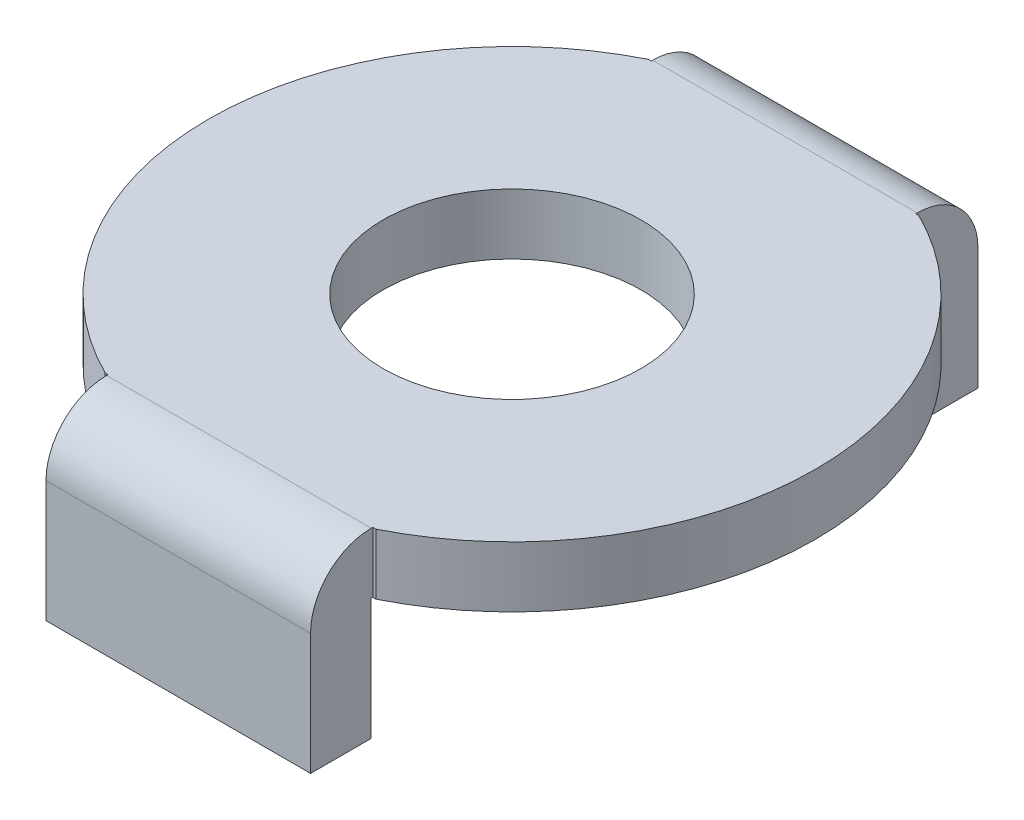
ISO-10303-21;
HEADER;
FILE_DESCRIPTION(('STEP AP214'),'2;1');
FILE_NAME('part.step','',(''),(''),'','','');
FILE_SCHEMA(('AUTOMOTIVE_DESIGN { 1 0 10303 214 1 1 1 1 }'));
ENDSEC;
DATA;
#1=APPLICATION_CONTEXT('core data for automotive mechanical design processes');
#2=APPLICATION_PROTOCOL_DEFINITION('international standard','automotive_design',2000,#1);
#3=PRODUCT_CONTEXT('',#1,'mechanical');
#4=PRODUCT('Part','Part','',(#3));
#5=PRODUCT_RELATED_PRODUCT_CATEGORY('part','',(#4));
#6=PRODUCT_DEFINITION_FORMATION('','',#4);
#7=PRODUCT_DEFINITION_CONTEXT('part definition',#1,'design');
#8=PRODUCT_DEFINITION('design','',#6,#7);
#9=PRODUCT_DEFINITION_SHAPE('','',#8);
#10=(LENGTH_UNIT() NAMED_UNIT(*) SI_UNIT(.MILLI.,.METRE.));
#11=(NAMED_UNIT(*) PLANE_ANGLE_UNIT() SI_UNIT($,.RADIAN.));
#12=(NAMED_UNIT(*) SI_UNIT($,.STERADIAN.) SOLID_ANGLE_UNIT());
#13=UNCERTAINTY_MEASURE_WITH_UNIT(LENGTH_MEASURE(1.E-05),#10,'distance_accuracy_value','');
#14=(GEOMETRIC_REPRESENTATION_CONTEXT(3) GLOBAL_UNCERTAINTY_ASSIGNED_CONTEXT((#13)) GLOBAL_UNIT_ASSIGNED_CONTEXT((#10,
#11,#12)) REPRESENTATION_CONTEXT('',''));
#15=CARTESIAN_POINT('',(0.,0.,0.));
#16=DIRECTION('',(0.,0.,1.));
#17=DIRECTION('',(1.,0.,0.));
#18=AXIS2_PLACEMENT_3D('',#15,#16,#17);
#19=CARTESIAN_POINT('',(4.360333,0.,9.));
#20=DIRECTION('',(1.,0.,0.));
#21=DIRECTION('',(0.,0.,-1.));
#22=AXIS2_PLACEMENT_3D('',#19,#20,#21);
#23=PLANE('',#22);
#24=DIRECTION('',(0.,0.,-1.));
#25=VECTOR('',#24,1.);
#26=CARTESIAN_POINT('',(4.360333,0.,9.));
#27=LINE('',#26,#25);
#28=CARTESIAN_POINT('',(4.360333,0.,9.));
#29=VERTEX_POINT('',#28);
#30=CARTESIAN_POINT('',(4.360333,0.,8.95));
#31=VERTEX_POINT('',#30);
#32=EDGE_CURVE('E237',#29,#31,#27,.T.);
#33=ORIENTED_EDGE('',*,*,#32,.T.);
#34=DIRECTION('',(0.,1.,0.));
#35=VECTOR('',#34,1.);
#36=CARTESIAN_POINT('',(4.360333,0.,8.95));
#37=LINE('',#36,#35);
#38=CARTESIAN_POINT('',(4.360333,2.,8.95));
#39=VERTEX_POINT('',#38);
#40=EDGE_CURVE('E50',#31,#39,#37,.T.);
#41=ORIENTED_EDGE('',*,*,#40,.T.);
#42=DIRECTION('',(0.,0.,1.));
#43=VECTOR('',#42,1.);
#44=CARTESIAN_POINT('',(4.360333,2.,-9.));
#45=LINE('',#44,#43);
#46=CARTESIAN_POINT('',(4.360333,2.,9.));
#47=VERTEX_POINT('',#46);
#48=EDGE_CURVE('E247',#39,#47,#45,.T.);
#49=ORIENTED_EDGE('',*,*,#48,.T.);
#50=CARTESIAN_POINT('',(4.360333,0.,9.));
#51=DIRECTION('',(1.,0.,0.));
#52=DIRECTION('',(0.,0.,-1.));
#53=AXIS2_PLACEMENT_3D('',#50,#51,#52);
#54=CIRCLE('',#53,2.);
#55=CARTESIAN_POINT('',(4.360333,0.,11.));
#56=VERTEX_POINT('',#55);
#57=EDGE_CURVE('E227',#47,#56,#54,.T.);
#58=ORIENTED_EDGE('',*,*,#57,.T.);
#59=DIRECTION('',(0.,-1.,0.));
#60=VECTOR('',#59,1.);
#61=CARTESIAN_POINT('',(4.360333,0.,11.));
#62=LINE('',#61,#60);
#63=CARTESIAN_POINT('',(4.360333,-4.,11.));
#64=VERTEX_POINT('',#63);
#65=EDGE_CURVE('E230',#56,#64,#62,.T.);
#66=ORIENTED_EDGE('',*,*,#65,.T.);
#67=DIRECTION('',(0.,0.,-1.));
#68=VECTOR('',#67,1.);
#69=CARTESIAN_POINT('',(4.360333,-4.,11.));
#70=LINE('',#69,#68);
#71=CARTESIAN_POINT('',(4.360333,-4.,9.));
#72=VERTEX_POINT('',#71);
#73=EDGE_CURVE('E232',#64,#72,#70,.T.);
#74=ORIENTED_EDGE('',*,*,#73,.T.);
#75=DIRECTION('',(0.,1.,0.));
#76=VECTOR('',#75,1.);
#77=CARTESIAN_POINT('',(4.360333,-4.,9.));
#78=LINE('',#77,#76);
#79=EDGE_CURVE('E234',#72,#29,#78,.T.);
#80=ORIENTED_EDGE('',*,*,#79,.T.);
#81=EDGE_LOOP('',(#33,#41,#49,#58,#66,#74,#80));
#82=FACE_BOUND('',#81,.T.);
#83=ADVANCED_FACE('F35',(#82),#23,.T.);
#84=CARTESIAN_POINT('',(4.360333,2.,-9.));
#85=VERTEX_POINT('',#84);
#86=CARTESIAN_POINT('',(4.360333,2.,-8.95));
#87=VERTEX_POINT('',#86);
#88=EDGE_CURVE('E58',#85,#87,#45,.T.);
#89=ORIENTED_EDGE('',*,*,#88,.T.);
#90=DIRECTION('',(0.,-1.,0.));
#91=VECTOR('',#90,1.);
#92=CARTESIAN_POINT('',(4.360333,0.,-8.95));
#93=LINE('',#92,#91);
#94=CARTESIAN_POINT('',(4.360333,0.,-8.95));
#95=VERTEX_POINT('',#94);
#96=EDGE_CURVE('E186',#87,#95,#93,.T.);
#97=ORIENTED_EDGE('',*,*,#96,.T.);
#98=CARTESIAN_POINT('',(4.360333,0.,-9.));
#99=VERTEX_POINT('',#98);
#100=EDGE_CURVE('E236',#95,#99,#27,.T.);
#101=ORIENTED_EDGE('',*,*,#100,.T.);
#102=DIRECTION('',(0.,-1.,0.));
#103=VECTOR('',#102,1.);
#104=CARTESIAN_POINT('',(4.360333,0.,-9.));
#105=LINE('',#104,#103);
#106=CARTESIAN_POINT('',(4.360333,-4.,-9.));
#107=VERTEX_POINT('',#106);
#108=EDGE_CURVE('E239',#99,#107,#105,.T.);
#109=ORIENTED_EDGE('',*,*,#108,.T.);
#110=DIRECTION('',(0.,0.,-1.));
#111=VECTOR('',#110,1.);
#112=CARTESIAN_POINT('',(4.360333,-4.,-9.));
#113=LINE('',#112,#111);
#114=CARTESIAN_POINT('',(4.360333,-4.,-11.));
#115=VERTEX_POINT('',#114);
#116=EDGE_CURVE('E241',#107,#115,#113,.T.);
#117=ORIENTED_EDGE('',*,*,#116,.T.);
#118=DIRECTION('',(0.,1.,0.));
#119=VECTOR('',#118,1.);
#120=CARTESIAN_POINT('',(4.360333,-4.,-11.));
#121=LINE('',#120,#119);
#122=CARTESIAN_POINT('',(4.360333,0.,-11.));
#123=VERTEX_POINT('',#122);
#124=EDGE_CURVE('E243',#115,#123,#121,.T.);
#125=ORIENTED_EDGE('',*,*,#124,.T.);
#126=CARTESIAN_POINT('',(4.360333,0.,-9.));
#127=DIRECTION('',(1.,0.,0.));
#128=DIRECTION('',(0.,0.,-1.));
#129=AXIS2_PLACEMENT_3D('',#126,#127,#128);
#130=CIRCLE('',#129,2.);
#131=EDGE_CURVE('E245',#123,#85,#130,.T.);
#132=ORIENTED_EDGE('',*,*,#131,.T.);
#133=EDGE_LOOP('',(#89,#97,#101,#109,#117,#125,#132));
#134=FACE_BOUND('',#133,.T.);
#135=ADVANCED_FACE('F289',(#134),#23,.T.);
#136=CARTESIAN_POINT('',(-4.360333,0.,9.));
#137=DIRECTION('',(1.,0.,0.));
#138=DIRECTION('',(0.,0.,-1.));
#139=AXIS2_PLACEMENT_3D('',#136,#137,#138);
#140=PLANE('',#139);
#141=DIRECTION('',(0.,1.,0.));
#142=VECTOR('',#141,1.);
#143=CARTESIAN_POINT('',(-4.360333,0.,8.95));
#144=LINE('',#143,#142);
#145=CARTESIAN_POINT('',(-4.360333,0.,8.95));
#146=VERTEX_POINT('',#145);
#147=CARTESIAN_POINT('',(-4.360333,2.,8.95));
#148=VERTEX_POINT('',#147);
#149=EDGE_CURVE('E11',#146,#148,#144,.T.);
#150=ORIENTED_EDGE('',*,*,#149,.F.);
#151=DIRECTION('',(0.,0.,-1.));
#152=VECTOR('',#151,1.);
#153=CARTESIAN_POINT('',(-4.360333,0.,9.));
#154=LINE('',#153,#152);
#155=CARTESIAN_POINT('',(-4.360333,0.,9.));
#156=VERTEX_POINT('',#155);
#157=EDGE_CURVE('E209',#156,#146,#154,.T.);
#158=ORIENTED_EDGE('',*,*,#157,.F.);
#159=DIRECTION('',(0.,1.,0.));
#160=VECTOR('',#159,1.);
#161=CARTESIAN_POINT('',(-4.360333,-4.,9.));
#162=LINE('',#161,#160);
#163=CARTESIAN_POINT('',(-4.360333,-4.,9.));
#164=VERTEX_POINT('',#163);
#165=EDGE_CURVE('E205',#164,#156,#162,.T.);
#166=ORIENTED_EDGE('',*,*,#165,.F.);
#167=DIRECTION('',(0.,0.,-1.));
#168=VECTOR('',#167,1.);
#169=CARTESIAN_POINT('',(-4.360333,-4.,11.));
#170=LINE('',#169,#168);
#171=CARTESIAN_POINT('',(-4.360333,-4.,11.));
#172=VERTEX_POINT('',#171);
#173=EDGE_CURVE('E202',#172,#164,#170,.T.);
#174=ORIENTED_EDGE('',*,*,#173,.F.);
#175=DIRECTION('',(0.,-1.,0.));
#176=VECTOR('',#175,1.);
#177=CARTESIAN_POINT('',(-4.360333,0.,11.));
#178=LINE('',#177,#176);
#179=CARTESIAN_POINT('',(-4.360333,0.,11.));
#180=VERTEX_POINT('',#179);
#181=EDGE_CURVE('E199',#180,#172,#178,.T.);
#182=ORIENTED_EDGE('',*,*,#181,.F.);
#183=CARTESIAN_POINT('',(-4.360333,0.,9.));
#184=DIRECTION('',(1.,0.,0.));
#185=DIRECTION('',(0.,0.,-1.));
#186=AXIS2_PLACEMENT_3D('',#183,#184,#185);
#187=CIRCLE('',#186,2.);
#188=CARTESIAN_POINT('',(-4.360333,2.,9.));
#189=VERTEX_POINT('',#188);
#190=EDGE_CURVE('E196',#189,#180,#187,.T.);
#191=ORIENTED_EDGE('',*,*,#190,.F.);
#192=DIRECTION('',(0.,0.,1.));
#193=VECTOR('',#192,1.);
#194=CARTESIAN_POINT('',(-4.360333,2.,-9.));
#195=LINE('',#194,#193);
#196=EDGE_CURVE('E224',#148,#189,#195,.T.);
#197=ORIENTED_EDGE('',*,*,#196,.F.);
#198=EDGE_LOOP('',(#150,#158,#166,#174,#182,#191,#197));
#199=FACE_BOUND('',#198,.T.);
#200=ADVANCED_FACE('F343',(#199),#140,.F.);
#201=DIRECTION('',(0.,-1.,0.));
#202=VECTOR('',#201,1.);
#203=CARTESIAN_POINT('',(-4.360333,0.,-8.95));
#204=LINE('',#203,#202);
#205=CARTESIAN_POINT('',(-4.360333,2.,-8.95));
#206=VERTEX_POINT('',#205);
#207=CARTESIAN_POINT('',(-4.360333,0.,-8.95));
#208=VERTEX_POINT('',#207);
#209=EDGE_CURVE('E43',#206,#208,#204,.T.);
#210=ORIENTED_EDGE('',*,*,#209,.F.);
#211=CARTESIAN_POINT('',(-4.360333,2.,-9.));
#212=VERTEX_POINT('',#211);
#213=EDGE_CURVE('E225',#212,#206,#195,.T.);
#214=ORIENTED_EDGE('',*,*,#213,.F.);
#215=CARTESIAN_POINT('',(-4.360333,0.,-9.));
#216=DIRECTION('',(1.,0.,0.));
#217=DIRECTION('',(0.,0.,-1.));
#218=AXIS2_PLACEMENT_3D('',#215,#216,#217);
#219=CIRCLE('',#218,2.);
#220=CARTESIAN_POINT('',(-4.360333,0.,-11.));
#221=VERTEX_POINT('',#220);
#222=EDGE_CURVE('E221',#221,#212,#219,.T.);
#223=ORIENTED_EDGE('',*,*,#222,.F.);
#224=DIRECTION('',(0.,1.,0.));
#225=VECTOR('',#224,1.);
#226=CARTESIAN_POINT('',(-4.360333,-4.,-11.));
#227=LINE('',#226,#225);
#228=CARTESIAN_POINT('',(-4.360333,-4.,-11.));
#229=VERTEX_POINT('',#228);
#230=EDGE_CURVE('E218',#229,#221,#227,.T.);
#231=ORIENTED_EDGE('',*,*,#230,.F.);
#232=DIRECTION('',(0.,0.,-1.));
#233=VECTOR('',#232,1.);
#234=CARTESIAN_POINT('',(-4.360333,-4.,-9.));
#235=LINE('',#234,#233);
#236=CARTESIAN_POINT('',(-4.360333,-4.,-9.));
#237=VERTEX_POINT('',#236);
#238=EDGE_CURVE('E215',#237,#229,#235,.T.);
#239=ORIENTED_EDGE('',*,*,#238,.F.);
#240=DIRECTION('',(0.,-1.,0.));
#241=VECTOR('',#240,1.);
#242=CARTESIAN_POINT('',(-4.360333,0.,-9.));
#243=LINE('',#242,#241);
#244=CARTESIAN_POINT('',(-4.360333,0.,-9.));
#245=VERTEX_POINT('',#244);
#246=EDGE_CURVE('E212',#245,#237,#243,.T.);
#247=ORIENTED_EDGE('',*,*,#246,.F.);
#248=EDGE_CURVE('E208',#208,#245,#154,.T.);
#249=ORIENTED_EDGE('',*,*,#248,.F.);
#250=EDGE_LOOP('',(#210,#214,#223,#231,#239,#247,#249));
#251=FACE_BOUND('',#250,.T.);
#252=ADVANCED_FACE('F279',(#251),#140,.F.);
#253=CARTESIAN_POINT('',(4.360333,0.,9.));
#254=DIRECTION('',(-1.,0.,0.));
#255=DIRECTION('',(0.,0.,1.));
#256=AXIS2_PLACEMENT_3D('',#253,#254,#255);
#257=CYLINDRICAL_SURFACE('',#256,2.);
#258=DIRECTION('',(-1.,0.,0.));
#259=VECTOR('',#258,1.);
#260=CARTESIAN_POINT('',(4.360333,2.,9.));
#261=LINE('',#260,#259);
#262=EDGE_CURVE('E249',#47,#189,#261,.T.);
#263=ORIENTED_EDGE('',*,*,#262,.T.);
#264=ORIENTED_EDGE('',*,*,#190,.T.);
#265=DIRECTION('',(-1.,0.,0.));
#266=VECTOR('',#265,1.);
#267=CARTESIAN_POINT('',(4.360333,0.,11.));
#268=LINE('',#267,#266);
#269=EDGE_CURVE('E269',#56,#180,#268,.T.);
#270=ORIENTED_EDGE('',*,*,#269,.F.);
#271=ORIENTED_EDGE('',*,*,#57,.F.);
#272=EDGE_LOOP('',(#263,#264,#270,#271));
#273=FACE_BOUND('',#272,.T.);
#274=ADVANCED_FACE('F37',(#273),#257,.T.);
#275=CARTESIAN_POINT('',(4.360333,0.,11.));
#276=DIRECTION('',(0.,0.,-1.));
#277=DIRECTION('',(-1.,0.,0.));
#278=AXIS2_PLACEMENT_3D('',#275,#276,#277);
#279=PLANE('',#278);
#280=ORIENTED_EDGE('',*,*,#269,.T.);
#281=ORIENTED_EDGE('',*,*,#181,.T.);
#282=DIRECTION('',(-1.,0.,0.));
#283=VECTOR('',#282,1.);
#284=CARTESIAN_POINT('',(4.360333,-4.,11.));
#285=LINE('',#284,#283);
#286=EDGE_CURVE('E267',#64,#172,#285,.T.);
#287=ORIENTED_EDGE('',*,*,#286,.F.);
#288=ORIENTED_EDGE('',*,*,#65,.F.);
#289=EDGE_LOOP('',(#280,#281,#287,#288));
#290=FACE_BOUND('',#289,.T.);
#291=ADVANCED_FACE('F440',(#290),#279,.F.);
#292=CARTESIAN_POINT('',(4.360333,-4.,11.));
#293=DIRECTION('',(0.,1.,0.));
#294=DIRECTION('',(0.,0.,1.));
#295=AXIS2_PLACEMENT_3D('',#292,#293,#294);
#296=PLANE('',#295);
#297=ORIENTED_EDGE('',*,*,#286,.T.);
#298=ORIENTED_EDGE('',*,*,#173,.T.);
#299=DIRECTION('',(-1.,0.,0.));
#300=VECTOR('',#299,1.);
#301=CARTESIAN_POINT('',(4.360333,-4.,9.));
#302=LINE('',#301,#300);
#303=EDGE_CURVE('E265',#72,#164,#302,.T.);
#304=ORIENTED_EDGE('',*,*,#303,.F.);
#305=ORIENTED_EDGE('',*,*,#73,.F.);
#306=EDGE_LOOP('',(#297,#298,#304,#305));
#307=FACE_BOUND('',#306,.T.);
#308=ADVANCED_FACE('F432',(#307),#296,.F.);
#309=CARTESIAN_POINT('',(4.360333,-4.,9.));
#310=DIRECTION('',(0.,0.,1.));
#311=DIRECTION('',(1.,0.,0.));
#312=AXIS2_PLACEMENT_3D('',#309,#310,#311);
#313=PLANE('',#312);
#314=ORIENTED_EDGE('',*,*,#303,.T.);
#315=ORIENTED_EDGE('',*,*,#165,.T.);
#316=DIRECTION('',(-1.,0.,0.));
#317=VECTOR('',#316,1.);
#318=CARTESIAN_POINT('',(4.360333,0.,9.));
#319=LINE('',#318,#317);
#320=EDGE_CURVE('E263',#29,#156,#319,.T.);
#321=ORIENTED_EDGE('',*,*,#320,.F.);
#322=ORIENTED_EDGE('',*,*,#79,.F.);
#323=EDGE_LOOP('',(#314,#315,#321,#322));
#324=FACE_BOUND('',#323,.T.);
#325=ADVANCED_FACE('F424',(#324),#313,.F.);
#326=CARTESIAN_POINT('',(4.360333,0.,9.));
#327=DIRECTION('',(0.,1.,0.));
#328=DIRECTION('',(0.,0.,1.));
#329=AXIS2_PLACEMENT_3D('',#326,#327,#328);
#330=PLANE('',#329);
#331=CARTESIAN_POINT('',(0.,0.,0.));
#332=DIRECTION('',(0.,1.,0.));
#333=DIRECTION('',(0.,0.,1.));
#334=AXIS2_PLACEMENT_3D('',#331,#332,#333);
#335=CIRCLE('',#334,4.25);
#336=CARTESIAN_POINT('',(0.,0.,4.25));
#337=VERTEX_POINT('',#336);
#338=EDGE_CURVE('E318',#337,#337,#335,.T.);
#339=ORIENTED_EDGE('',*,*,#338,.T.);
#340=EDGE_LOOP('',(#339));
#341=FACE_BOUND('',#340,.T.);
#342=DIRECTION('',(-1.,0.,0.));
#343=VECTOR('',#342,1.);
#344=CARTESIAN_POINT('',(4.46066138593819,0.,-8.95));
#345=LINE('',#344,#343);
#346=CARTESIAN_POINT('',(-4.46066138593819,0.,-8.95));
#347=VERTEX_POINT('',#346);
#348=EDGE_CURVE('E275',#208,#347,#345,.T.);
#349=ORIENTED_EDGE('',*,*,#348,.F.);
#350=ORIENTED_EDGE('',*,*,#248,.T.);
#351=DIRECTION('',(-1.,0.,0.));
#352=VECTOR('',#351,1.);
#353=CARTESIAN_POINT('',(4.360333,0.,-9.));
#354=LINE('',#353,#352);
#355=EDGE_CURVE('E260',#99,#245,#354,.T.);
#356=ORIENTED_EDGE('',*,*,#355,.F.);
#357=ORIENTED_EDGE('',*,*,#100,.F.);
#358=CARTESIAN_POINT('',(4.46066138593819,0.,-8.95));
#359=VERTEX_POINT('',#358);
#360=EDGE_CURVE('E181',#359,#95,#345,.T.);
#361=ORIENTED_EDGE('',*,*,#360,.F.);
#362=CARTESIAN_POINT('',(0.,0.,0.));
#363=DIRECTION('',(0.,1.,0.));
#364=DIRECTION('',(0.,0.,1.));
#365=AXIS2_PLACEMENT_3D('',#362,#363,#364);
#366=CIRCLE('',#365,10.);
#367=CARTESIAN_POINT('',(4.46066138593819,0.,8.95));
#368=VERTEX_POINT('',#367);
#369=EDGE_CURVE('E295',#368,#359,#366,.T.);
#370=ORIENTED_EDGE('',*,*,#369,.F.);
#371=DIRECTION('',(1.,0.,0.));
#372=VECTOR('',#371,1.);
#373=CARTESIAN_POINT('',(-4.46066138593819,0.,8.95));
#374=LINE('',#373,#372);
#375=EDGE_CURVE('E312',#31,#368,#374,.T.);
#376=ORIENTED_EDGE('',*,*,#375,.F.);
#377=ORIENTED_EDGE('',*,*,#32,.F.);
#378=ORIENTED_EDGE('',*,*,#320,.T.);
#379=ORIENTED_EDGE('',*,*,#157,.T.);
#380=CARTESIAN_POINT('',(-4.46066138593819,0.,8.95));
#381=VERTEX_POINT('',#380);
#382=EDGE_CURVE('E311',#381,#146,#374,.T.);
#383=ORIENTED_EDGE('',*,*,#382,.F.);
#384=CARTESIAN_POINT('',(0.,0.,0.));
#385=DIRECTION('',(0.,1.,0.));
#386=DIRECTION('',(0.,0.,1.));
#387=AXIS2_PLACEMENT_3D('',#384,#385,#386);
#388=CIRCLE('',#387,10.);
#389=EDGE_CURVE('E185',#347,#381,#388,.T.);
#390=ORIENTED_EDGE('',*,*,#389,.F.);
#391=EDGE_LOOP('',(#349,#350,#356,#357,#361,#370,#376,#377,#378,#379,#383,#390));
#392=FACE_BOUND('',#391,.T.);
#393=ADVANCED_FACE('F283',(#341,#392),#330,.F.);
#394=CARTESIAN_POINT('',(4.360333,0.,-9.));
#395=DIRECTION('',(0.,0.,-1.));
#396=DIRECTION('',(-1.,0.,0.));
#397=AXIS2_PLACEMENT_3D('',#394,#395,#396);
#398=PLANE('',#397);
#399=ORIENTED_EDGE('',*,*,#355,.T.);
#400=ORIENTED_EDGE('',*,*,#246,.T.);
#401=DIRECTION('',(-1.,0.,0.));
#402=VECTOR('',#401,1.);
#403=CARTESIAN_POINT('',(4.360333,-4.,-9.));
#404=LINE('',#403,#402);
#405=EDGE_CURVE('E258',#107,#237,#404,.T.);
#406=ORIENTED_EDGE('',*,*,#405,.F.);
#407=ORIENTED_EDGE('',*,*,#108,.F.);
#408=EDGE_LOOP('',(#399,#400,#406,#407));
#409=FACE_BOUND('',#408,.T.);
#410=ADVANCED_FACE('F286',(#409),#398,.F.);
#411=CARTESIAN_POINT('',(4.360333,-4.,-9.));
#412=DIRECTION('',(0.,1.,0.));
#413=DIRECTION('',(0.,0.,1.));
#414=AXIS2_PLACEMENT_3D('',#411,#412,#413);
#415=PLANE('',#414);
#416=ORIENTED_EDGE('',*,*,#405,.T.);
#417=ORIENTED_EDGE('',*,*,#238,.T.);
#418=DIRECTION('',(-1.,0.,0.));
#419=VECTOR('',#418,1.);
#420=CARTESIAN_POINT('',(4.360333,-4.,-11.));
#421=LINE('',#420,#419);
#422=EDGE_CURVE('E256',#115,#229,#421,.T.);
#423=ORIENTED_EDGE('',*,*,#422,.F.);
#424=ORIENTED_EDGE('',*,*,#116,.F.);
#425=EDGE_LOOP('',(#416,#417,#423,#424));
#426=FACE_BOUND('',#425,.T.);
#427=ADVANCED_FACE('F400',(#426),#415,.F.);
#428=CARTESIAN_POINT('',(4.360333,-4.,-11.));
#429=DIRECTION('',(0.,0.,1.));
#430=DIRECTION('',(1.,0.,0.));
#431=AXIS2_PLACEMENT_3D('',#428,#429,#430);
#432=PLANE('',#431);
#433=ORIENTED_EDGE('',*,*,#422,.T.);
#434=ORIENTED_EDGE('',*,*,#230,.T.);
#435=DIRECTION('',(-1.,0.,0.));
#436=VECTOR('',#435,1.);
#437=CARTESIAN_POINT('',(4.360333,0.,-11.));
#438=LINE('',#437,#436);
#439=EDGE_CURVE('E254',#123,#221,#438,.T.);
#440=ORIENTED_EDGE('',*,*,#439,.F.);
#441=ORIENTED_EDGE('',*,*,#124,.F.);
#442=EDGE_LOOP('',(#433,#434,#440,#441));
#443=FACE_BOUND('',#442,.T.);
#444=ADVANCED_FACE('F335',(#443),#432,.F.);
#445=CARTESIAN_POINT('',(4.360333,0.,-9.));
#446=DIRECTION('',(-1.,0.,0.));
#447=DIRECTION('',(0.,0.,1.));
#448=AXIS2_PLACEMENT_3D('',#445,#446,#447);
#449=CYLINDRICAL_SURFACE('',#448,2.);
#450=ORIENTED_EDGE('',*,*,#439,.T.);
#451=ORIENTED_EDGE('',*,*,#222,.T.);
#452=DIRECTION('',(-1.,0.,0.));
#453=VECTOR('',#452,1.);
#454=CARTESIAN_POINT('',(4.360333,2.,-9.));
#455=LINE('',#454,#453);
#456=EDGE_CURVE('E252',#85,#212,#455,.T.);
#457=ORIENTED_EDGE('',*,*,#456,.F.);
#458=ORIENTED_EDGE('',*,*,#131,.F.);
#459=EDGE_LOOP('',(#450,#451,#457,#458));
#460=FACE_BOUND('',#459,.T.);
#461=ADVANCED_FACE('F328',(#460),#449,.T.);
#462=CARTESIAN_POINT('',(4.360333,2.,-9.));
#463=DIRECTION('',(0.,-1.,0.));
#464=DIRECTION('',(0.,0.,-1.));
#465=AXIS2_PLACEMENT_3D('',#462,#463,#464);
#466=PLANE('',#465);
#467=CARTESIAN_POINT('',(0.,2.,0.));
#468=DIRECTION('',(0.,1.,0.));
#469=DIRECTION('',(0.,0.,1.));
#470=AXIS2_PLACEMENT_3D('',#467,#468,#469);
#471=CIRCLE('',#470,4.25);
#472=CARTESIAN_POINT('',(0.,2.,4.25));
#473=VERTEX_POINT('',#472);
#474=EDGE_CURVE('E315',#473,#473,#471,.T.);
#475=ORIENTED_EDGE('',*,*,#474,.F.);
#476=EDGE_LOOP('',(#475));
#477=FACE_BOUND('',#476,.T.);
#478=DIRECTION('',(-1.,0.,0.));
#479=VECTOR('',#478,1.);
#480=CARTESIAN_POINT('',(4.46066138593819,2.,-8.95));
#481=LINE('',#480,#479);
#482=CARTESIAN_POINT('',(4.46066138593819,2.,-8.95));
#483=VERTEX_POINT('',#482);
#484=EDGE_CURVE('E303',#483,#87,#481,.T.);
#485=ORIENTED_EDGE('',*,*,#484,.T.);
#486=ORIENTED_EDGE('',*,*,#88,.F.);
#487=ORIENTED_EDGE('',*,*,#456,.T.);
#488=ORIENTED_EDGE('',*,*,#213,.T.);
#489=CARTESIAN_POINT('',(-4.46066138593819,2.,-8.95));
#490=VERTEX_POINT('',#489);
#491=EDGE_CURVE('E177',#206,#490,#481,.T.);
#492=ORIENTED_EDGE('',*,*,#491,.T.);
#493=CARTESIAN_POINT('',(0.,2.,0.));
#494=DIRECTION('',(0.,1.,0.));
#495=DIRECTION('',(0.,0.,1.));
#496=AXIS2_PLACEMENT_3D('',#493,#494,#495);
#497=CIRCLE('',#496,10.);
#498=CARTESIAN_POINT('',(-4.46066138593819,2.,8.95));
#499=VERTEX_POINT('',#498);
#500=EDGE_CURVE('E173',#490,#499,#497,.T.);
#501=ORIENTED_EDGE('',*,*,#500,.T.);
#502=DIRECTION('',(1.,0.,0.));
#503=VECTOR('',#502,1.);
#504=CARTESIAN_POINT('',(-4.46066138593819,2.,8.95));
#505=LINE('',#504,#503);
#506=EDGE_CURVE('E160',#499,#148,#505,.T.);
#507=ORIENTED_EDGE('',*,*,#506,.T.);
#508=ORIENTED_EDGE('',*,*,#196,.T.);
#509=ORIENTED_EDGE('',*,*,#262,.F.);
#510=ORIENTED_EDGE('',*,*,#48,.F.);
#511=CARTESIAN_POINT('',(4.46066138593819,2.,8.95));
#512=VERTEX_POINT('',#511);
#513=EDGE_CURVE('E170',#39,#512,#505,.T.);
#514=ORIENTED_EDGE('',*,*,#513,.T.);
#515=CARTESIAN_POINT('',(0.,2.,0.));
#516=DIRECTION('',(0.,1.,0.));
#517=DIRECTION('',(0.,0.,1.));
#518=AXIS2_PLACEMENT_3D('',#515,#516,#517);
#519=CIRCLE('',#518,10.);
#520=EDGE_CURVE('E169',#512,#483,#519,.T.);
#521=ORIENTED_EDGE('',*,*,#520,.T.);
#522=EDGE_LOOP('',(#485,#486,#487,#488,#492,#501,#507,#508,#509,#510,#514,#521));
#523=FACE_BOUND('',#522,.T.);
#524=ADVANCED_FACE('F175',(#477,#523),#466,.F.);
#525=CARTESIAN_POINT('',(0.,2.,0.));
#526=DIRECTION('',(0.,-1.,0.));
#527=DIRECTION('',(0.,0.,-1.));
#528=AXIS2_PLACEMENT_3D('',#525,#526,#527);
#529=CYLINDRICAL_SURFACE('',#528,10.);
#530=ORIENTED_EDGE('',*,*,#389,.T.);
#531=DIRECTION('',(0.,-1.,0.));
#532=VECTOR('',#531,1.);
#533=CARTESIAN_POINT('',(-4.46066138593819,2.,8.95));
#534=LINE('',#533,#532);
#535=EDGE_CURVE('E164',#499,#381,#534,.T.);
#536=ORIENTED_EDGE('',*,*,#535,.F.);
#537=ORIENTED_EDGE('',*,*,#500,.F.);
#538=DIRECTION('',(0.,-1.,0.));
#539=VECTOR('',#538,1.);
#540=CARTESIAN_POINT('',(-4.46066138593819,2.,-8.95));
#541=LINE('',#540,#539);
#542=EDGE_CURVE('E302',#490,#347,#541,.T.);
#543=ORIENTED_EDGE('',*,*,#542,.T.);
#544=EDGE_LOOP('',(#530,#536,#537,#543));
#545=FACE_BOUND('',#544,.T.);
#546=ADVANCED_FACE('F183',(#545),#529,.T.);
#547=CARTESIAN_POINT('',(4.46066138593819,2.,-8.95));
#548=DIRECTION('',(0.,0.,1.));
#549=DIRECTION('',(1.,0.,0.));
#550=AXIS2_PLACEMENT_3D('',#547,#548,#549);
#551=PLANE('',#550);
#552=ORIENTED_EDGE('',*,*,#491,.F.);
#553=ORIENTED_EDGE('',*,*,#209,.T.);
#554=ORIENTED_EDGE('',*,*,#348,.T.);
#555=ORIENTED_EDGE('',*,*,#542,.F.);
#556=EDGE_LOOP('',(#552,#553,#554,#555));
#557=FACE_BOUND('',#556,.T.);
#558=ADVANCED_FACE('F274',(#557),#551,.F.);
#559=CARTESIAN_POINT('',(-4.46066138593819,2.,8.95));
#560=DIRECTION('',(0.,0.,-1.));
#561=DIRECTION('',(-1.,0.,0.));
#562=AXIS2_PLACEMENT_3D('',#559,#560,#561);
#563=PLANE('',#562);
#564=ORIENTED_EDGE('',*,*,#382,.T.);
#565=ORIENTED_EDGE('',*,*,#149,.T.);
#566=ORIENTED_EDGE('',*,*,#506,.F.);
#567=ORIENTED_EDGE('',*,*,#535,.T.);
#568=EDGE_LOOP('',(#564,#565,#566,#567));
#569=FACE_BOUND('',#568,.T.);
#570=ADVANCED_FACE('F162',(#569),#563,.F.);
#571=ORIENTED_EDGE('',*,*,#40,.F.);
#572=ORIENTED_EDGE('',*,*,#375,.T.);
#573=DIRECTION('',(0.,-1.,0.));
#574=VECTOR('',#573,1.);
#575=CARTESIAN_POINT('',(4.46066138593819,2.,8.95));
#576=LINE('',#575,#574);
#577=EDGE_CURVE('E187',#512,#368,#576,.T.);
#578=ORIENTED_EDGE('',*,*,#577,.F.);
#579=ORIENTED_EDGE('',*,*,#513,.F.);
#580=EDGE_LOOP('',(#571,#572,#578,#579));
#581=FACE_BOUND('',#580,.T.);
#582=ADVANCED_FACE('F348',(#581),#563,.F.);
#583=CARTESIAN_POINT('',(0.,2.,0.));
#584=DIRECTION('',(0.,-1.,0.));
#585=DIRECTION('',(0.,0.,-1.));
#586=AXIS2_PLACEMENT_3D('',#583,#584,#585);
#587=CYLINDRICAL_SURFACE('',#586,10.);
#588=ORIENTED_EDGE('',*,*,#369,.T.);
#589=DIRECTION('',(0.,-1.,0.));
#590=VECTOR('',#589,1.);
#591=CARTESIAN_POINT('',(4.46066138593819,2.,-8.95));
#592=LINE('',#591,#590);
#593=EDGE_CURVE('E191',#483,#359,#592,.T.);
#594=ORIENTED_EDGE('',*,*,#593,.F.);
#595=ORIENTED_EDGE('',*,*,#520,.F.);
#596=ORIENTED_EDGE('',*,*,#577,.T.);
#597=EDGE_LOOP('',(#588,#594,#595,#596));
#598=FACE_BOUND('',#597,.T.);
#599=ADVANCED_FACE('F309',(#598),#587,.T.);
#600=ORIENTED_EDGE('',*,*,#96,.F.);
#601=ORIENTED_EDGE('',*,*,#484,.F.);
#602=ORIENTED_EDGE('',*,*,#593,.T.);
#603=ORIENTED_EDGE('',*,*,#360,.T.);
#604=EDGE_LOOP('',(#600,#601,#602,#603));
#605=FACE_BOUND('',#604,.T.);
#606=ADVANCED_FACE('F306',(#605),#551,.F.);
#607=CARTESIAN_POINT('',(0.,2.,0.));
#608=DIRECTION('',(0.,-1.,0.));
#609=DIRECTION('',(0.,0.,-1.));
#610=AXIS2_PLACEMENT_3D('',#607,#608,#609);
#611=CYLINDRICAL_SURFACE('',#610,4.25);
#612=ORIENTED_EDGE('',*,*,#474,.T.);
#613=EDGE_LOOP('',(#612));
#614=FACE_BOUND('',#613,.T.);
#615=ORIENTED_EDGE('',*,*,#338,.F.);
#616=EDGE_LOOP('',(#615));
#617=FACE_BOUND('',#616,.T.);
#618=ADVANCED_FACE('F324',(#614,#617),#611,.F.);
#619=CLOSED_SHELL('',(#83,#135,#200,#252,#274,#291,#308,#325,#393,#410,#427,#444,#461,#524,#546,
#558,#570,#582,#599,#606,#618));
#620=MANIFOLD_SOLID_BREP('B2',#619);
#621=ADVANCED_BREP_SHAPE_REPRESENTATION('',(#18,#620),#14);
#622=SHAPE_DEFINITION_REPRESENTATION(#9,#621);
ENDSEC;
END-ISO-10303-21;
